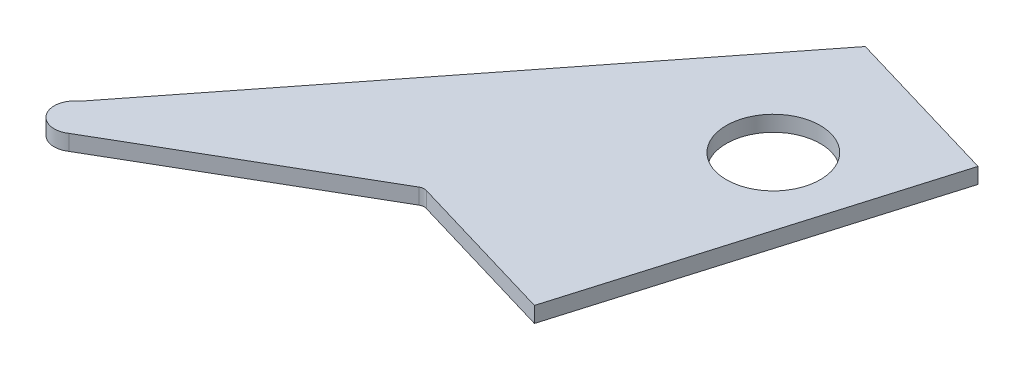
ISO-10303-21;
HEADER;
FILE_DESCRIPTION(('STEP AP214'),'2;1');
FILE_NAME('part.step','',(''),(''),'','','');
FILE_SCHEMA(('AUTOMOTIVE_DESIGN { 1 0 10303 214 1 1 1 1 }'));
ENDSEC;
DATA;
#1=APPLICATION_CONTEXT('core data for automotive mechanical design processes');
#2=APPLICATION_PROTOCOL_DEFINITION('international standard','automotive_design',2000,#1);
#3=PRODUCT_CONTEXT('',#1,'mechanical');
#4=PRODUCT('Part','Part','',(#3));
#5=PRODUCT_RELATED_PRODUCT_CATEGORY('part','',(#4));
#6=PRODUCT_DEFINITION_FORMATION('','',#4);
#7=PRODUCT_DEFINITION_CONTEXT('part definition',#1,'design');
#8=PRODUCT_DEFINITION('design','',#6,#7);
#9=PRODUCT_DEFINITION_SHAPE('','',#8);
#10=(LENGTH_UNIT() NAMED_UNIT(*) SI_UNIT(.MILLI.,.METRE.));
#11=(NAMED_UNIT(*) PLANE_ANGLE_UNIT() SI_UNIT($,.RADIAN.));
#12=(NAMED_UNIT(*) SI_UNIT($,.STERADIAN.) SOLID_ANGLE_UNIT());
#13=UNCERTAINTY_MEASURE_WITH_UNIT(LENGTH_MEASURE(1.E-05),#10,'distance_accuracy_value','');
#14=(GEOMETRIC_REPRESENTATION_CONTEXT(3) GLOBAL_UNCERTAINTY_ASSIGNED_CONTEXT((#13)) GLOBAL_UNIT_ASSIGNED_CONTEXT((#10,
#11,#12)) REPRESENTATION_CONTEXT('',''));
#15=CARTESIAN_POINT('',(0.,0.,0.));
#16=DIRECTION('',(0.,0.,1.));
#17=DIRECTION('',(1.,0.,0.));
#18=AXIS2_PLACEMENT_3D('',#15,#16,#17);
#19=CARTESIAN_POINT('',(24.2687822482393,4.7625,33.7222913548281));
#20=DIRECTION('',(0.,-1.,0.));
#21=DIRECTION('',(0.,0.,-1.));
#22=AXIS2_PLACEMENT_3D('',#19,#20,#21);
#23=CYLINDRICAL_SURFACE('',#22,2.54);
#24=CARTESIAN_POINT('',(24.2687822482393,0.,33.7222913548281));
#25=DIRECTION('',(0.,-1.,0.));
#26=DIRECTION('',(0.,0.,-1.));
#27=AXIS2_PLACEMENT_3D('',#24,#25,#26);
#28=CIRCLE('',#27,2.54);
#29=CARTESIAN_POINT('',(22.9946247329012,0.,31.5249924161065));
#30=VERTEX_POINT('',#29);
#31=CARTESIAN_POINT('',(24.9901812237873,0.,31.2868892282629));
#32=VERTEX_POINT('',#31);
#33=EDGE_CURVE('E129',#30,#32,#28,.T.);
#34=ORIENTED_EDGE('',*,*,#33,.T.);
#35=DIRECTION('',(0.,-1.,0.));
#36=VECTOR('',#35,1.);
#37=CARTESIAN_POINT('',(24.9901812237873,4.7625,31.2868892282629));
#38=LINE('',#37,#36);
#39=CARTESIAN_POINT('',(24.9901812237873,4.7625,31.2868892282629));
#40=VERTEX_POINT('',#39);
#41=EDGE_CURVE('E11',#40,#32,#38,.T.);
#42=ORIENTED_EDGE('',*,*,#41,.F.);
#43=CARTESIAN_POINT('',(24.2687822482393,4.7625,33.7222913548281));
#44=DIRECTION('',(0.,-1.,0.));
#45=DIRECTION('',(0.,0.,-1.));
#46=AXIS2_PLACEMENT_3D('',#43,#44,#45);
#47=CIRCLE('',#46,2.54);
#48=CARTESIAN_POINT('',(22.9946247329012,4.7625,31.5249924161065));
#49=VERTEX_POINT('',#48);
#50=EDGE_CURVE('E142',#49,#40,#47,.T.);
#51=ORIENTED_EDGE('',*,*,#50,.F.);
#52=DIRECTION('',(0.,-1.,0.));
#53=VECTOR('',#52,1.);
#54=CARTESIAN_POINT('',(22.9946247329012,4.7625,31.5249924161065));
#55=LINE('',#54,#53);
#56=EDGE_CURVE('E125',#49,#30,#55,.T.);
#57=ORIENTED_EDGE('',*,*,#56,.T.);
#58=EDGE_LOOP('',(#34,#42,#51,#57));
#59=FACE_BOUND('',#58,.T.);
#60=ADVANCED_FACE('F39',(#59),#23,.F.);
#61=CARTESIAN_POINT('',(71.7331323202995,4.7625,45.1327821374025));
#62=DIRECTION('',(0.284015344703924,0.,-0.958819734868193));
#63=DIRECTION('',(-0.958819734868193,0.,-0.284015344703924));
#64=AXIS2_PLACEMENT_3D('',#61,#62,#63);
#65=PLANE('',#64);
#66=DIRECTION('',(0.958819734868193,0.,0.284015344703924));
#67=VECTOR('',#66,1.);
#68=CARTESIAN_POINT('',(71.7331323202995,0.,45.1327821374025));
#69=LINE('',#68,#67);
#70=CARTESIAN_POINT('',(71.7331323202995,0.,45.1327821374025));
#71=VERTEX_POINT('',#70);
#72=EDGE_CURVE('E132',#32,#71,#69,.T.);
#73=ORIENTED_EDGE('',*,*,#72,.T.);
#74=DIRECTION('',(0.,-1.,0.));
#75=VECTOR('',#74,1.);
#76=CARTESIAN_POINT('',(71.7331323202995,4.7625,45.1327821374025));
#77=LINE('',#76,#75);
#78=CARTESIAN_POINT('',(71.7331323202995,4.7625,45.1327821374025));
#79=VERTEX_POINT('',#78);
#80=EDGE_CURVE('E47',#79,#71,#77,.T.);
#81=ORIENTED_EDGE('',*,*,#80,.F.);
#82=DIRECTION('',(0.958819734868193,0.,0.284015344703924));
#83=VECTOR('',#82,1.);
#84=CARTESIAN_POINT('',(71.7331323202995,4.7625,45.1327821374025));
#85=LINE('',#84,#83);
#86=EDGE_CURVE('E95',#40,#79,#85,.T.);
#87=ORIENTED_EDGE('',*,*,#86,.F.);
#88=ORIENTED_EDGE('',*,*,#41,.T.);
#89=EDGE_LOOP('',(#73,#81,#87,#88));
#90=FACE_BOUND('',#89,.T.);
#91=ADVANCED_FACE('F189',(#90),#65,.F.);
#92=CARTESIAN_POINT('',(102.562489384099,4.7625,-58.9453830648475));
#93=DIRECTION('',(-0.958819734868193,0.,-0.284015344703923));
#94=DIRECTION('',(-0.284015344703923,0.,0.958819734868193));
#95=AXIS2_PLACEMENT_3D('',#92,#93,#94);
#96=PLANE('',#95);
#97=DIRECTION('',(0.284015344703923,0.,-0.958819734868193));
#98=VECTOR('',#97,1.);
#99=CARTESIAN_POINT('',(102.562489384099,0.,-58.9453830648475));
#100=LINE('',#99,#98);
#101=CARTESIAN_POINT('',(102.562489384099,0.,-58.9453830648475));
#102=VERTEX_POINT('',#101);
#103=EDGE_CURVE('E135',#71,#102,#100,.T.);
#104=ORIENTED_EDGE('',*,*,#103,.T.);
#105=DIRECTION('',(0.,-1.,0.));
#106=VECTOR('',#105,1.);
#107=CARTESIAN_POINT('',(102.562489384099,4.7625,-58.9453830648475));
#108=LINE('',#107,#106);
#109=CARTESIAN_POINT('',(102.562489384099,4.7625,-58.9453830648475));
#110=VERTEX_POINT('',#109);
#111=EDGE_CURVE('E146',#110,#102,#108,.T.);
#112=ORIENTED_EDGE('',*,*,#111,.F.);
#113=DIRECTION('',(0.284015344703923,0.,-0.958819734868193));
#114=VECTOR('',#113,1.);
#115=CARTESIAN_POINT('',(102.562489384099,4.7625,-58.9453830648475));
#116=LINE('',#115,#114);
#117=EDGE_CURVE('E154',#79,#110,#116,.T.);
#118=ORIENTED_EDGE('',*,*,#117,.F.);
#119=ORIENTED_EDGE('',*,*,#80,.T.);
#120=EDGE_LOOP('',(#104,#112,#118,#119));
#121=FACE_BOUND('',#120,.T.);
#122=ADVANCED_FACE('F152',(#121),#96,.F.);
#123=CARTESIAN_POINT('',(53.8544468527947,4.7625,-73.3733625758069));
#124=DIRECTION('',(-0.284015344703923,0.,0.958819734868193));
#125=DIRECTION('',(0.958819734868193,0.,0.284015344703923));
#126=AXIS2_PLACEMENT_3D('',#123,#124,#125);
#127=PLANE('',#126);
#128=DIRECTION('',(-0.958819734868193,0.,-0.284015344703923));
#129=VECTOR('',#128,1.);
#130=CARTESIAN_POINT('',(53.8544468527947,0.,-73.3733625758069));
#131=LINE('',#130,#129);
#132=CARTESIAN_POINT('',(53.8544468527947,0.,-73.3733625758069));
#133=VERTEX_POINT('',#132);
#134=EDGE_CURVE('E137',#102,#133,#131,.T.);
#135=ORIENTED_EDGE('',*,*,#134,.T.);
#136=DIRECTION('',(0.,-1.,0.));
#137=VECTOR('',#136,1.);
#138=CARTESIAN_POINT('',(53.8544468527947,4.7625,-73.3733625758069));
#139=LINE('',#138,#137);
#140=CARTESIAN_POINT('',(53.8544468527947,4.7625,-73.3733625758069));
#141=VERTEX_POINT('',#140);
#142=EDGE_CURVE('E120',#141,#133,#139,.T.);
#143=ORIENTED_EDGE('',*,*,#142,.F.);
#144=DIRECTION('',(-0.958819734868193,0.,-0.284015344703923));
#145=VECTOR('',#144,1.);
#146=CARTESIAN_POINT('',(53.8544468527947,4.7625,-73.3733625758069));
#147=LINE('',#146,#145);
#148=EDGE_CURVE('E111',#110,#141,#147,.T.);
#149=ORIENTED_EDGE('',*,*,#148,.F.);
#150=ORIENTED_EDGE('',*,*,#111,.T.);
#151=EDGE_LOOP('',(#135,#143,#149,#150));
#152=FACE_BOUND('',#151,.T.);
#153=ADVANCED_FACE('F160',(#152),#127,.F.);
#154=CARTESIAN_POINT('',(-51.2625744636408,4.7625,60.5756932444762));
#155=DIRECTION('',(0.78668530020585,0.,0.617354224444955));
#156=DIRECTION('',(0.617354224444955,0.,-0.78668530020585));
#157=AXIS2_PLACEMENT_3D('',#154,#155,#156);
#158=PLANE('',#157);
#159=DIRECTION('',(-0.617354224444955,0.,0.78668530020585));
#160=VECTOR('',#159,1.);
#161=CARTESIAN_POINT('',(-51.2625744636408,0.,60.5756932444762));
#162=LINE('',#161,#160);
#163=CARTESIAN_POINT('',(-51.2625744636408,0.,60.5756932444762));
#164=VERTEX_POINT('',#163);
#165=EDGE_CURVE('E119',#133,#164,#162,.T.);
#166=ORIENTED_EDGE('',*,*,#165,.T.);
#167=DIRECTION('',(0.,-1.,0.));
#168=VECTOR('',#167,1.);
#169=CARTESIAN_POINT('',(-51.2625744636408,4.7625,60.5756932444762));
#170=LINE('',#169,#168);
#171=CARTESIAN_POINT('',(-51.2625744636408,4.7625,60.5756932444762));
#172=VERTEX_POINT('',#171);
#173=EDGE_CURVE('E116',#172,#164,#170,.T.);
#174=ORIENTED_EDGE('',*,*,#173,.F.);
#175=DIRECTION('',(-0.617354224444955,0.,0.78668530020585));
#176=VECTOR('',#175,1.);
#177=CARTESIAN_POINT('',(-51.2625744636408,4.7625,60.5756932444762));
#178=LINE('',#177,#176);
#179=EDGE_CURVE('E105',#141,#172,#178,.T.);
#180=ORIENTED_EDGE('',*,*,#179,.F.);
#181=ORIENTED_EDGE('',*,*,#142,.T.);
#182=EDGE_LOOP('',(#166,#174,#180,#181));
#183=FACE_BOUND('',#182,.T.);
#184=ADVANCED_FACE('F117',(#183),#158,.F.);
#185=CARTESIAN_POINT('',(-47.7943561351052,4.7625,65.5691379328517));
#186=DIRECTION('',(0.,-1.,0.));
#187=DIRECTION('',(0.,0.,-1.));
#188=AXIS2_PLACEMENT_3D('',#185,#186,#187);
#189=CYLINDRICAL_SURFACE('',#188,6.07972270998077);
#190=CARTESIAN_POINT('',(-47.7943561351052,0.,65.5691379328517));
#191=DIRECTION('',(0.,1.,0.));
#192=DIRECTION('',(0.,0.,-1.));
#193=AXIS2_PLACEMENT_3D('',#190,#191,#192);
#194=CIRCLE('',#193,6.07972270998077);
#195=CARTESIAN_POINT('',(-44.3261378065697,0.,70.5625826212273));
#196=VERTEX_POINT('',#195);
#197=EDGE_CURVE('E81',#164,#196,#194,.T.);
#198=ORIENTED_EDGE('',*,*,#197,.T.);
#199=DIRECTION('',(0.,-1.,0.));
#200=VECTOR('',#199,1.);
#201=CARTESIAN_POINT('',(-44.3261378065697,4.7625,70.5625826212273));
#202=LINE('',#201,#200);
#203=CARTESIAN_POINT('',(-44.3261378065697,4.7625,70.5625826212273));
#204=VERTEX_POINT('',#203);
#205=EDGE_CURVE('E121',#204,#196,#202,.T.);
#206=ORIENTED_EDGE('',*,*,#205,.F.);
#207=CARTESIAN_POINT('',(-47.7943561351052,4.7625,65.5691379328517));
#208=DIRECTION('',(0.,1.,0.));
#209=DIRECTION('',(0.,0.,-1.));
#210=AXIS2_PLACEMENT_3D('',#207,#208,#209);
#211=CIRCLE('',#210,6.07972270998077);
#212=EDGE_CURVE('E109',#172,#204,#211,.T.);
#213=ORIENTED_EDGE('',*,*,#212,.F.);
#214=ORIENTED_EDGE('',*,*,#173,.T.);
#215=EDGE_LOOP('',(#198,#206,#213,#214));
#216=FACE_BOUND('',#215,.T.);
#217=ADVANCED_FACE('F123',(#216),#189,.T.);
#218=CARTESIAN_POINT('',(22.9946247329012,4.7625,31.5249924161065));
#219=DIRECTION('',(-0.501636817062268,0.,-0.865078322331358));
#220=DIRECTION('',(-0.865078322331358,0.,0.501636817062268));
#221=AXIS2_PLACEMENT_3D('',#218,#219,#220);
#222=PLANE('',#221);
#223=DIRECTION('',(0.865078322331358,0.,-0.501636817062268));
#224=VECTOR('',#223,1.);
#225=CARTESIAN_POINT('',(22.9946247329012,0.,31.5249924161065));
#226=LINE('',#225,#224);
#227=EDGE_CURVE('E87',#196,#30,#226,.T.);
#228=ORIENTED_EDGE('',*,*,#227,.T.);
#229=ORIENTED_EDGE('',*,*,#56,.F.);
#230=DIRECTION('',(0.865078322331358,0.,-0.501636817062268));
#231=VECTOR('',#230,1.);
#232=CARTESIAN_POINT('',(22.9946247329012,4.7625,31.5249924161065));
#233=LINE('',#232,#231);
#234=EDGE_CURVE('E55',#204,#49,#233,.T.);
#235=ORIENTED_EDGE('',*,*,#234,.F.);
#236=ORIENTED_EDGE('',*,*,#205,.T.);
#237=EDGE_LOOP('',(#228,#229,#235,#236));
#238=FACE_BOUND('',#237,.T.);
#239=ADVANCED_FACE('F179',(#238),#222,.F.);
#240=CARTESIAN_POINT('',(24.2687822482393,4.7625,33.7222913548281));
#241=DIRECTION('',(0.,-1.,0.));
#242=DIRECTION('',(0.,0.,-1.));
#243=AXIS2_PLACEMENT_3D('',#240,#241,#242);
#244=PLANE('',#243);
#245=CARTESIAN_POINT('',(67.8044081753151,4.7625,-31.4484236404847));
#246=DIRECTION('',(0.,1.,0.));
#247=DIRECTION('',(0.,0.,1.));
#248=AXIS2_PLACEMENT_3D('',#245,#246,#247);
#249=CIRCLE('',#248,14.2875);
#250=CARTESIAN_POINT('',(67.8044081753151,4.7625,-17.1609236404847));
#251=VERTEX_POINT('',#250);
#252=EDGE_CURVE('E165',#251,#251,#249,.T.);
#253=ORIENTED_EDGE('',*,*,#252,.F.);
#254=EDGE_LOOP('',(#253));
#255=FACE_BOUND('',#254,.T.);
#256=ORIENTED_EDGE('',*,*,#50,.T.);
#257=ORIENTED_EDGE('',*,*,#86,.T.);
#258=ORIENTED_EDGE('',*,*,#117,.T.);
#259=ORIENTED_EDGE('',*,*,#148,.T.);
#260=ORIENTED_EDGE('',*,*,#179,.T.);
#261=ORIENTED_EDGE('',*,*,#212,.T.);
#262=ORIENTED_EDGE('',*,*,#234,.T.);
#263=EDGE_LOOP('',(#256,#257,#258,#259,#260,#261,#262));
#264=FACE_BOUND('',#263,.T.);
#265=ADVANCED_FACE('F107',(#255,#264),#244,.F.);
#266=CARTESIAN_POINT('',(24.2687822482393,0.,33.7222913548281));
#267=DIRECTION('',(0.,-1.,0.));
#268=DIRECTION('',(0.,0.,-1.));
#269=AXIS2_PLACEMENT_3D('',#266,#267,#268);
#270=PLANE('',#269);
#271=CARTESIAN_POINT('',(67.8044081753151,0.,-31.4484236404847));
#272=DIRECTION('',(0.,1.,0.));
#273=DIRECTION('',(0.,0.,1.));
#274=AXIS2_PLACEMENT_3D('',#271,#272,#273);
#275=CIRCLE('',#274,14.2875);
#276=CARTESIAN_POINT('',(67.8044081753151,0.,-17.1609236404847));
#277=VERTEX_POINT('',#276);
#278=EDGE_CURVE('E133',#277,#277,#275,.T.);
#279=ORIENTED_EDGE('',*,*,#278,.T.);
#280=EDGE_LOOP('',(#279));
#281=FACE_BOUND('',#280,.T.);
#282=ORIENTED_EDGE('',*,*,#33,.F.);
#283=ORIENTED_EDGE('',*,*,#227,.F.);
#284=ORIENTED_EDGE('',*,*,#197,.F.);
#285=ORIENTED_EDGE('',*,*,#165,.F.);
#286=ORIENTED_EDGE('',*,*,#134,.F.);
#287=ORIENTED_EDGE('',*,*,#103,.F.);
#288=ORIENTED_EDGE('',*,*,#72,.F.);
#289=EDGE_LOOP('',(#282,#283,#284,#285,#286,#287,#288));
#290=FACE_BOUND('',#289,.T.);
#291=ADVANCED_FACE('F158',(#281,#290),#270,.T.);
#292=CARTESIAN_POINT('',(67.8044081753151,0.,-31.4484236404847));
#293=DIRECTION('',(0.,1.,0.));
#294=DIRECTION('',(0.,0.,1.));
#295=AXIS2_PLACEMENT_3D('',#292,#293,#294);
#296=CYLINDRICAL_SURFACE('',#295,14.2875);
#297=CARTESIAN_POINT('',(67.8044081753151,0.,-17.1609236404847));
#298=CARTESIAN_POINT('',(67.8044081753151,0.049609375,-17.1609236404847));
#299=CARTESIAN_POINT('',(67.8044081753151,0.09921875,-17.1609236404847));
#300=CARTESIAN_POINT('',(67.8044081753151,0.1984375,-17.1609236404847));
#301=CARTESIAN_POINT('',(67.8044081753151,0.248046875,-17.1609236404847));
#302=CARTESIAN_POINT('',(67.8044081753151,0.347265625,-17.1609236404847));
#303=CARTESIAN_POINT('',(67.8044081753151,0.396875,-17.1609236404847));
#304=CARTESIAN_POINT('',(67.8044081753151,0.49609375,-17.1609236404847));
#305=CARTESIAN_POINT('',(67.8044081753151,0.545703125,-17.1609236404847));
#306=CARTESIAN_POINT('',(67.8044081753151,0.644921875,-17.1609236404847));
#307=CARTESIAN_POINT('',(67.8044081753151,0.69453125,-17.1609236404847));
#308=CARTESIAN_POINT('',(67.8044081753151,0.79375,-17.1609236404847));
#309=CARTESIAN_POINT('',(67.8044081753151,0.843359375,-17.1609236404847));
#310=CARTESIAN_POINT('',(67.8044081753151,0.942578125,-17.1609236404847));
#311=CARTESIAN_POINT('',(67.8044081753151,0.9921875,-17.1609236404847));
#312=CARTESIAN_POINT('',(67.8044081753151,1.09140625,-17.1609236404847));
#313=CARTESIAN_POINT('',(67.8044081753151,1.141015625,-17.1609236404847));
#314=CARTESIAN_POINT('',(67.8044081753151,1.240234375,-17.1609236404847));
#315=CARTESIAN_POINT('',(67.8044081753151,1.28984375,-17.1609236404847));
#316=CARTESIAN_POINT('',(67.8044081753151,1.3890625,-17.1609236404847));
#317=CARTESIAN_POINT('',(67.8044081753151,1.438671875,-17.1609236404847));
#318=CARTESIAN_POINT('',(67.8044081753151,1.537890625,-17.1609236404847));
#319=CARTESIAN_POINT('',(67.8044081753151,1.5875,-17.1609236404847));
#320=CARTESIAN_POINT('',(67.8044081753151,1.68671875,-17.1609236404847));
#321=CARTESIAN_POINT('',(67.8044081753151,1.736328125,-17.1609236404847));
#322=CARTESIAN_POINT('',(67.8044081753151,1.835546875,-17.1609236404847));
#323=CARTESIAN_POINT('',(67.8044081753151,1.88515625,-17.1609236404847));
#324=CARTESIAN_POINT('',(67.8044081753151,1.984375,-17.1609236404847));
#325=CARTESIAN_POINT('',(67.8044081753151,2.033984375,-17.1609236404847));
#326=CARTESIAN_POINT('',(67.8044081753151,2.133203125,-17.1609236404847));
#327=CARTESIAN_POINT('',(67.8044081753151,2.1828125,-17.1609236404847));
#328=CARTESIAN_POINT('',(67.8044081753151,2.28203125,-17.1609236404847));
#329=CARTESIAN_POINT('',(67.8044081753151,2.331640625,-17.1609236404847));
#330=CARTESIAN_POINT('',(67.8044081753151,2.430859375,-17.1609236404847));
#331=CARTESIAN_POINT('',(67.8044081753151,2.48046875,-17.1609236404847));
#332=CARTESIAN_POINT('',(67.8044081753151,2.5796875,-17.1609236404847));
#333=CARTESIAN_POINT('',(67.8044081753151,2.629296875,-17.1609236404847));
#334=CARTESIAN_POINT('',(67.8044081753151,2.728515625,-17.1609236404847));
#335=CARTESIAN_POINT('',(67.8044081753151,2.778125,-17.1609236404847));
#336=CARTESIAN_POINT('',(67.8044081753151,2.87734375,-17.1609236404847));
#337=CARTESIAN_POINT('',(67.8044081753151,2.926953125,-17.1609236404847));
#338=CARTESIAN_POINT('',(67.8044081753151,3.026171875,-17.1609236404847));
#339=CARTESIAN_POINT('',(67.8044081753151,3.07578125,-17.1609236404847));
#340=CARTESIAN_POINT('',(67.8044081753151,3.175,-17.1609236404847));
#341=CARTESIAN_POINT('',(67.8044081753151,3.224609375,-17.1609236404847));
#342=CARTESIAN_POINT('',(67.8044081753151,3.323828125,-17.1609236404847));
#343=CARTESIAN_POINT('',(67.8044081753151,3.3734375,-17.1609236404847));
#344=CARTESIAN_POINT('',(67.8044081753151,3.47265625,-17.1609236404847));
#345=CARTESIAN_POINT('',(67.8044081753151,3.522265625,-17.1609236404847));
#346=CARTESIAN_POINT('',(67.8044081753151,3.621484375,-17.1609236404847));
#347=CARTESIAN_POINT('',(67.8044081753151,3.67109375,-17.1609236404847));
#348=CARTESIAN_POINT('',(67.8044081753151,3.7703125,-17.1609236404847));
#349=CARTESIAN_POINT('',(67.8044081753151,3.819921875,-17.1609236404847));
#350=CARTESIAN_POINT('',(67.8044081753151,3.919140625,-17.1609236404847));
#351=CARTESIAN_POINT('',(67.8044081753151,3.96875,-17.1609236404847));
#352=CARTESIAN_POINT('',(67.8044081753151,4.06796875,-17.1609236404847));
#353=CARTESIAN_POINT('',(67.8044081753151,4.117578125,-17.1609236404847));
#354=CARTESIAN_POINT('',(67.8044081753151,4.216796875,-17.1609236404847));
#355=CARTESIAN_POINT('',(67.8044081753151,4.26640625,-17.1609236404847));
#356=CARTESIAN_POINT('',(67.8044081753151,4.365625,-17.1609236404847));
#357=CARTESIAN_POINT('',(67.8044081753151,4.415234375,-17.1609236404847));
#358=CARTESIAN_POINT('',(67.8044081753151,4.514453125,-17.1609236404847));
#359=CARTESIAN_POINT('',(67.8044081753151,4.5640625,-17.1609236404847));
#360=CARTESIAN_POINT('',(67.8044081753151,4.66328125,-17.1609236404847));
#361=CARTESIAN_POINT('',(67.8044081753151,4.712890625,-17.1609236404847));
#362=CARTESIAN_POINT('',(67.8044081753151,4.7625,-17.1609236404847));
#363=B_SPLINE_CURVE_WITH_KNOTS('',3,(#297,#298,#299,#300,#301,#302,#303,#304,#305,#306,#307,
#308,#309,#310,#311,#312,#313,#314,#315,#316,#317,#318,#319,#320,#321,#322,#323,#324,#325,#326,
#327,#328,#329,#330,#331,#332,#333,#334,#335,#336,#337,#338,#339,#340,#341,#342,#343,#344,#345,
#346,#347,#348,#349,#350,#351,#352,#353,#354,#355,#356,#357,#358,#359,#360,#361,#362),
.UNSPECIFIED.,.F.,.F.,(4,2,2,2,2,2,2,2,2,2,2,2,2,2,2,2,2,2,2,2,2,2,2,2,2,2,2,2,2,2,2,2,4),(0.,
0.148828125,0.29765625,0.446484375,0.5953125,0.744140625,0.89296875,1.041796875,1.190625,
1.339453125,1.48828125,1.637109375,1.7859375,1.934765625,2.08359375,2.232421875,2.38125,
2.530078125,2.67890625,2.827734375,2.9765625,3.125390625,3.27421875,3.423046875,3.571875,
3.720703125,3.86953125,4.018359375,4.1671875,4.316015625,4.46484375,4.613671875,4.7625),.UNSPECIFIED.);
#364=EDGE_CURVE('BSEAM172',#277,#251,#363,.T.);
#365=ORIENTED_EDGE('',*,*,#278,.F.);
#366=ORIENTED_EDGE('',*,*,#252,.T.);
#367=ORIENTED_EDGE('',*,*,#364,.T.);
#368=ORIENTED_EDGE('',*,*,#364,.F.);
#369=EDGE_LOOP('',(#365,#367,#366,#368));
#370=FACE_BOUND('',#369,.T.);
#371=ADVANCED_FACE('F172',(#370),#296,.F.);
#372=CLOSED_SHELL('',(#60,#91,#122,#153,#184,#217,#239,#265,#291,#371));
#373=MANIFOLD_SOLID_BREP('B2',#372);
#374=ADVANCED_BREP_SHAPE_REPRESENTATION('',(#18,#373),#14);
#375=SHAPE_DEFINITION_REPRESENTATION(#9,#374);
ENDSEC;
END-ISO-10303-21;
